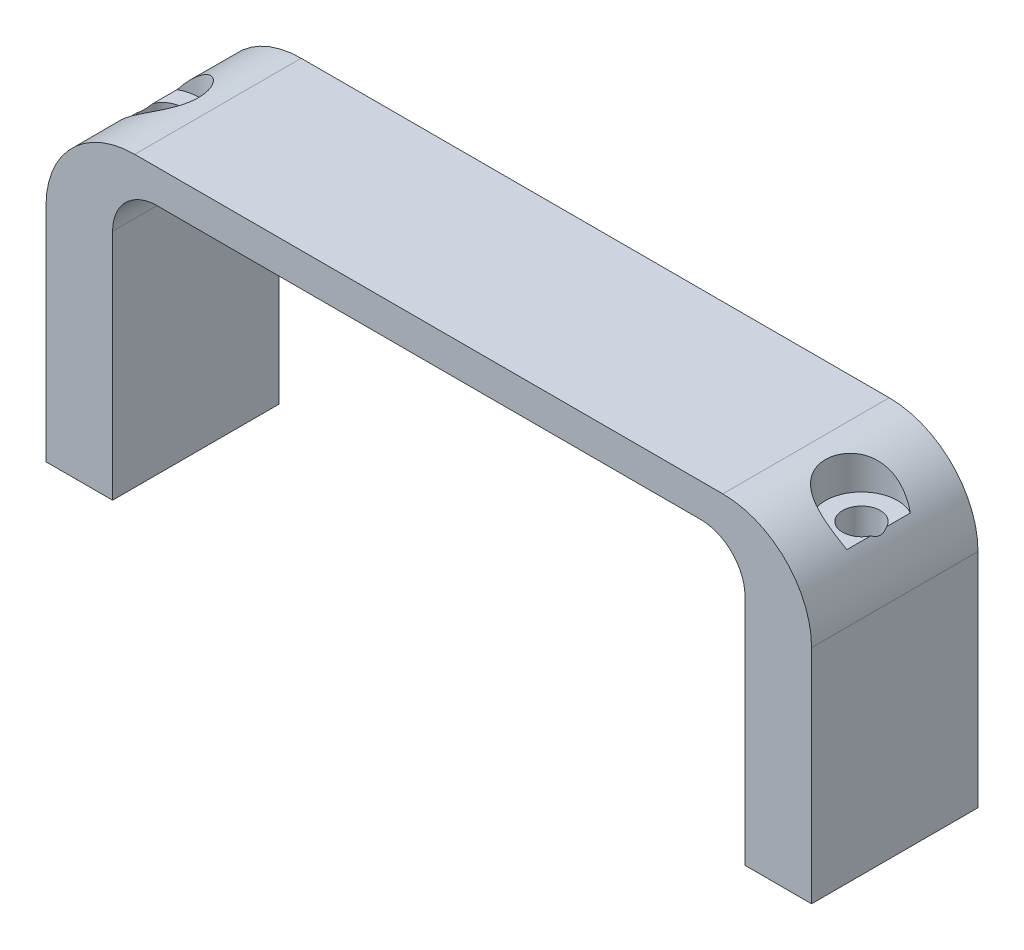
ISO-10303-21;
HEADER;
FILE_DESCRIPTION(('STEP AP214'),'2;1');
FILE_NAME('part.step','',(''),(''),'','','');
FILE_SCHEMA(('AUTOMOTIVE_DESIGN { 1 0 10303 214 1 1 1 1 }'));
ENDSEC;
DATA;
#1=APPLICATION_CONTEXT('core data for automotive mechanical design processes');
#2=APPLICATION_PROTOCOL_DEFINITION('international standard','automotive_design',2000,#1);
#3=PRODUCT_CONTEXT('',#1,'mechanical');
#4=PRODUCT('Part','Part','',(#3));
#5=PRODUCT_RELATED_PRODUCT_CATEGORY('part','',(#4));
#6=PRODUCT_DEFINITION_FORMATION('','',#4);
#7=PRODUCT_DEFINITION_CONTEXT('part definition',#1,'design');
#8=PRODUCT_DEFINITION('design','',#6,#7);
#9=PRODUCT_DEFINITION_SHAPE('','',#8);
#10=(LENGTH_UNIT() NAMED_UNIT(*) SI_UNIT(.MILLI.,.METRE.));
#11=(NAMED_UNIT(*) PLANE_ANGLE_UNIT() SI_UNIT($,.RADIAN.));
#12=(NAMED_UNIT(*) SI_UNIT($,.STERADIAN.) SOLID_ANGLE_UNIT());
#13=UNCERTAINTY_MEASURE_WITH_UNIT(LENGTH_MEASURE(1.E-05),#10,'distance_accuracy_value','');
#14=(GEOMETRIC_REPRESENTATION_CONTEXT(3) GLOBAL_UNCERTAINTY_ASSIGNED_CONTEXT((#13)) GLOBAL_UNIT_ASSIGNED_CONTEXT((#10,
#11,#12)) REPRESENTATION_CONTEXT('',''));
#15=CARTESIAN_POINT('',(0.,0.,0.));
#16=DIRECTION('',(0.,0.,1.));
#17=DIRECTION('',(1.,0.,0.));
#18=AXIS2_PLACEMENT_3D('',#15,#16,#17);
#19=CARTESIAN_POINT('',(-31.7717961729434,-8.00000000000006,15.));
#20=DIRECTION('',(1.,0.,0.));
#21=DIRECTION('',(0.,0.,-1.));
#22=AXIS2_PLACEMENT_3D('',#19,#20,#21);
#23=PLANE('',#22);
#24=DIRECTION('',(0.,-1.,0.));
#25=VECTOR('',#24,1.);
#26=CARTESIAN_POINT('',(-31.7717961729434,-8.00000000000006,0.));
#27=LINE('',#26,#25);
#28=CARTESIAN_POINT('',(-31.7717961729434,-8.00000000000006,0.));
#29=VERTEX_POINT('',#28);
#30=CARTESIAN_POINT('',(-31.7717961729434,-28.,0.));
#31=VERTEX_POINT('',#30);
#32=EDGE_CURVE('E261',#29,#31,#27,.T.);
#33=ORIENTED_EDGE('',*,*,#32,.T.);
#34=DIRECTION('',(0.,0.,-1.));
#35=VECTOR('',#34,1.);
#36=CARTESIAN_POINT('',(-31.7717961729434,-28.,15.));
#37=LINE('',#36,#35);
#38=CARTESIAN_POINT('',(-31.7717961729434,-28.,15.));
#39=VERTEX_POINT('',#38);
#40=EDGE_CURVE('E201',#39,#31,#37,.T.);
#41=ORIENTED_EDGE('',*,*,#40,.F.);
#42=DIRECTION('',(0.,-1.,0.));
#43=VECTOR('',#42,1.);
#44=CARTESIAN_POINT('',(-31.7717961729434,-8.00000000000006,15.));
#45=LINE('',#44,#43);
#46=CARTESIAN_POINT('',(-31.7717961729434,-8.00000000000006,15.));
#47=VERTEX_POINT('',#46);
#48=EDGE_CURVE('E291',#47,#39,#45,.T.);
#49=ORIENTED_EDGE('',*,*,#48,.F.);
#50=DIRECTION('',(0.,0.,-1.));
#51=VECTOR('',#50,1.);
#52=CARTESIAN_POINT('',(-31.7717961729434,-8.00000000000006,15.));
#53=LINE('',#52,#51);
#54=EDGE_CURVE('E292',#47,#29,#53,.T.);
#55=ORIENTED_EDGE('',*,*,#54,.T.);
#56=EDGE_LOOP('',(#33,#41,#49,#55));
#57=FACE_BOUND('',#56,.T.);
#58=ADVANCED_FACE('F33',(#57),#23,.F.);
#59=CARTESIAN_POINT('',(-25.7717961729434,-28.,15.));
#60=DIRECTION('',(0.,1.,0.));
#61=DIRECTION('',(0.,0.,1.));
#62=AXIS2_PLACEMENT_3D('',#59,#60,#61);
#63=PLANE('',#62);
#64=CARTESIAN_POINT('',(-28.7717961729434,-28.,7.5));
#65=DIRECTION('',(0.,1.,0.));
#66=DIRECTION('',(0.,0.,1.));
#67=AXIS2_PLACEMENT_3D('',#64,#65,#66);
#68=CIRCLE('',#67,1.69999999999999);
#69=CARTESIAN_POINT('',(-28.7717961729434,-28.,9.19999999999999));
#70=VERTEX_POINT('',#69);
#71=EDGE_CURVE('E248',#70,#70,#68,.T.);
#72=ORIENTED_EDGE('',*,*,#71,.T.);
#73=EDGE_LOOP('',(#72));
#74=FACE_BOUND('',#73,.T.);
#75=DIRECTION('',(1.,0.,0.));
#76=VECTOR('',#75,1.);
#77=CARTESIAN_POINT('',(-25.7717961729434,-28.,0.));
#78=LINE('',#77,#76);
#79=CARTESIAN_POINT('',(-25.7717961729434,-28.,0.));
#80=VERTEX_POINT('',#79);
#81=EDGE_CURVE('E251',#31,#80,#78,.T.);
#82=ORIENTED_EDGE('',*,*,#81,.T.);
#83=DIRECTION('',(0.,0.,-1.));
#84=VECTOR('',#83,1.);
#85=CARTESIAN_POINT('',(-25.7717961729434,-28.,15.));
#86=LINE('',#85,#84);
#87=CARTESIAN_POINT('',(-25.7717961729434,-28.,15.));
#88=VERTEX_POINT('',#87);
#89=EDGE_CURVE('E253',#88,#80,#86,.T.);
#90=ORIENTED_EDGE('',*,*,#89,.F.);
#91=DIRECTION('',(1.,0.,0.));
#92=VECTOR('',#91,1.);
#93=CARTESIAN_POINT('',(-25.7717961729434,-28.,15.));
#94=LINE('',#93,#92);
#95=EDGE_CURVE('E329',#39,#88,#94,.T.);
#96=ORIENTED_EDGE('',*,*,#95,.F.);
#97=ORIENTED_EDGE('',*,*,#40,.T.);
#98=EDGE_LOOP('',(#82,#90,#96,#97));
#99=FACE_BOUND('',#98,.T.);
#100=ADVANCED_FACE('F236',(#74,#99),#63,.F.);
#101=CARTESIAN_POINT('',(-25.7717961729434,-7.00000000000003,15.));
#102=DIRECTION('',(-1.,0.,0.));
#103=DIRECTION('',(0.,-1.,0.));
#104=AXIS2_PLACEMENT_3D('',#101,#102,#103);
#105=PLANE('',#104);
#106=DIRECTION('',(0.,1.,0.));
#107=VECTOR('',#106,1.);
#108=CARTESIAN_POINT('',(-25.7717961729434,-7.00000000000003,0.));
#109=LINE('',#108,#107);
#110=CARTESIAN_POINT('',(-25.7717961729434,-7.00000000000003,0.));
#111=VERTEX_POINT('',#110);
#112=EDGE_CURVE('E260',#80,#111,#109,.T.);
#113=ORIENTED_EDGE('',*,*,#112,.T.);
#114=DIRECTION('',(0.,0.,-1.));
#115=VECTOR('',#114,1.);
#116=CARTESIAN_POINT('',(-25.7717961729434,-7.00000000000003,15.));
#117=LINE('',#116,#115);
#118=CARTESIAN_POINT('',(-25.7717961729434,-7.00000000000003,15.));
#119=VERTEX_POINT('',#118);
#120=EDGE_CURVE('E266',#119,#111,#117,.T.);
#121=ORIENTED_EDGE('',*,*,#120,.F.);
#122=DIRECTION('',(0.,1.,0.));
#123=VECTOR('',#122,1.);
#124=CARTESIAN_POINT('',(-25.7717961729434,-7.00000000000003,15.));
#125=LINE('',#124,#123);
#126=EDGE_CURVE('E265',#88,#119,#125,.T.);
#127=ORIENTED_EDGE('',*,*,#126,.F.);
#128=ORIENTED_EDGE('',*,*,#89,.T.);
#129=EDGE_LOOP('',(#113,#121,#127,#128));
#130=FACE_BOUND('',#129,.T.);
#131=ADVANCED_FACE('F233',(#130),#105,.F.);
#132=CARTESIAN_POINT('',(-21.7717961729434,-7.,15.));
#133=DIRECTION('',(0.,0.,-1.));
#134=DIRECTION('',(-1.,0.,0.));
#135=AXIS2_PLACEMENT_3D('',#132,#133,#134);
#136=CYLINDRICAL_SURFACE('',#135,4.);
#137=CARTESIAN_POINT('',(-21.7717961729434,-7.,0.));
#138=DIRECTION('',(0.,0.,-1.));
#139=DIRECTION('',(1.,0.,0.));
#140=AXIS2_PLACEMENT_3D('',#137,#138,#139);
#141=CIRCLE('',#140,4.);
#142=CARTESIAN_POINT('',(-21.7717961729434,-3.,0.));
#143=VERTEX_POINT('',#142);
#144=EDGE_CURVE('E270',#111,#143,#141,.T.);
#145=ORIENTED_EDGE('',*,*,#144,.T.);
#146=DIRECTION('',(0.,0.,-1.));
#147=VECTOR('',#146,1.);
#148=CARTESIAN_POINT('',(-21.7717961729434,-3.,15.));
#149=LINE('',#148,#147);
#150=CARTESIAN_POINT('',(-21.7717961729434,-3.,15.));
#151=VERTEX_POINT('',#150);
#152=EDGE_CURVE('E317',#151,#143,#149,.T.);
#153=ORIENTED_EDGE('',*,*,#152,.F.);
#154=CARTESIAN_POINT('',(-21.7717961729434,-7.,15.));
#155=DIRECTION('',(0.,0.,-1.));
#156=DIRECTION('',(1.,0.,0.));
#157=AXIS2_PLACEMENT_3D('',#154,#155,#156);
#158=CIRCLE('',#157,4.);
#159=EDGE_CURVE('E322',#119,#151,#158,.T.);
#160=ORIENTED_EDGE('',*,*,#159,.F.);
#161=ORIENTED_EDGE('',*,*,#120,.T.);
#162=EDGE_LOOP('',(#145,#153,#160,#161));
#163=FACE_BOUND('',#162,.T.);
#164=ADVANCED_FACE('F229',(#163),#136,.F.);
#165=CARTESIAN_POINT('',(27.2282038270566,-2.99999999999999,15.));
#166=DIRECTION('',(0.,1.,0.));
#167=DIRECTION('',(-1.,0.,0.));
#168=AXIS2_PLACEMENT_3D('',#165,#166,#167);
#169=PLANE('',#168);
#170=DIRECTION('',(1.,0.,0.));
#171=VECTOR('',#170,1.);
#172=CARTESIAN_POINT('',(27.2282038270566,-2.99999999999999,0.));
#173=LINE('',#172,#171);
#174=CARTESIAN_POINT('',(27.2282038270566,-2.99999999999999,0.));
#175=VERTEX_POINT('',#174);
#176=EDGE_CURVE('E272',#143,#175,#173,.T.);
#177=ORIENTED_EDGE('',*,*,#176,.T.);
#178=DIRECTION('',(0.,0.,-1.));
#179=VECTOR('',#178,1.);
#180=CARTESIAN_POINT('',(27.2282038270566,-2.99999999999999,15.));
#181=LINE('',#180,#179);
#182=CARTESIAN_POINT('',(27.2282038270566,-2.99999999999999,15.));
#183=VERTEX_POINT('',#182);
#184=EDGE_CURVE('E314',#183,#175,#181,.T.);
#185=ORIENTED_EDGE('',*,*,#184,.F.);
#186=DIRECTION('',(1.,0.,0.));
#187=VECTOR('',#186,1.);
#188=CARTESIAN_POINT('',(27.2282038270566,-2.99999999999999,15.));
#189=LINE('',#188,#187);
#190=EDGE_CURVE('E325',#151,#183,#189,.T.);
#191=ORIENTED_EDGE('',*,*,#190,.F.);
#192=ORIENTED_EDGE('',*,*,#152,.T.);
#193=EDGE_LOOP('',(#177,#185,#191,#192));
#194=FACE_BOUND('',#193,.T.);
#195=ADVANCED_FACE('F225',(#194),#169,.F.);
#196=CARTESIAN_POINT('',(27.2282038270566,-6.99999999999999,15.));
#197=DIRECTION('',(0.,0.,-1.));
#198=DIRECTION('',(-1.,0.,0.));
#199=AXIS2_PLACEMENT_3D('',#196,#197,#198);
#200=CYLINDRICAL_SURFACE('',#199,4.);
#201=CARTESIAN_POINT('',(27.2282038270566,-6.99999999999999,0.));
#202=DIRECTION('',(0.,0.,-1.));
#203=DIRECTION('',(1.,0.,0.));
#204=AXIS2_PLACEMENT_3D('',#201,#202,#203);
#205=CIRCLE('',#204,4.);
#206=CARTESIAN_POINT('',(31.2282038270566,-7.00000000000002,0.));
#207=VERTEX_POINT('',#206);
#208=EDGE_CURVE('E277',#175,#207,#205,.T.);
#209=ORIENTED_EDGE('',*,*,#208,.T.);
#210=DIRECTION('',(0.,0.,-1.));
#211=VECTOR('',#210,1.);
#212=CARTESIAN_POINT('',(31.2282038270566,-7.00000000000002,15.));
#213=LINE('',#212,#211);
#214=CARTESIAN_POINT('',(31.2282038270566,-7.00000000000002,15.));
#215=VERTEX_POINT('',#214);
#216=EDGE_CURVE('E311',#215,#207,#213,.T.);
#217=ORIENTED_EDGE('',*,*,#216,.F.);
#218=CARTESIAN_POINT('',(27.2282038270566,-6.99999999999999,15.));
#219=DIRECTION('',(0.,0.,-1.));
#220=DIRECTION('',(1.,0.,0.));
#221=AXIS2_PLACEMENT_3D('',#218,#219,#220);
#222=CIRCLE('',#221,4.);
#223=EDGE_CURVE('E327',#183,#215,#222,.T.);
#224=ORIENTED_EDGE('',*,*,#223,.F.);
#225=ORIENTED_EDGE('',*,*,#184,.T.);
#226=EDGE_LOOP('',(#209,#217,#224,#225));
#227=FACE_BOUND('',#226,.T.);
#228=ADVANCED_FACE('F221',(#227),#200,.F.);
#229=CARTESIAN_POINT('',(31.2282038270566,-28.,15.));
#230=DIRECTION('',(1.,0.,0.));
#231=DIRECTION('',(0.,1.,0.));
#232=AXIS2_PLACEMENT_3D('',#229,#230,#231);
#233=PLANE('',#232);
#234=DIRECTION('',(0.,-1.,0.));
#235=VECTOR('',#234,1.);
#236=CARTESIAN_POINT('',(31.2282038270566,-28.,0.));
#237=LINE('',#236,#235);
#238=CARTESIAN_POINT('',(31.2282038270566,-28.,0.));
#239=VERTEX_POINT('',#238);
#240=EDGE_CURVE('E279',#207,#239,#237,.T.);
#241=ORIENTED_EDGE('',*,*,#240,.T.);
#242=DIRECTION('',(0.,0.,-1.));
#243=VECTOR('',#242,1.);
#244=CARTESIAN_POINT('',(31.2282038270566,-28.,15.));
#245=LINE('',#244,#243);
#246=CARTESIAN_POINT('',(31.2282038270566,-28.,15.));
#247=VERTEX_POINT('',#246);
#248=EDGE_CURVE('E308',#247,#239,#245,.T.);
#249=ORIENTED_EDGE('',*,*,#248,.F.);
#250=DIRECTION('',(0.,-1.,0.));
#251=VECTOR('',#250,1.);
#252=CARTESIAN_POINT('',(31.2282038270566,-28.,15.));
#253=LINE('',#252,#251);
#254=EDGE_CURVE('E334',#215,#247,#253,.T.);
#255=ORIENTED_EDGE('',*,*,#254,.F.);
#256=ORIENTED_EDGE('',*,*,#216,.T.);
#257=EDGE_LOOP('',(#241,#249,#255,#256));
#258=FACE_BOUND('',#257,.T.);
#259=ADVANCED_FACE('F217',(#258),#233,.F.);
#260=CARTESIAN_POINT('',(37.2282038270566,-28.,15.));
#261=DIRECTION('',(0.,1.,0.));
#262=DIRECTION('',(0.,0.,1.));
#263=AXIS2_PLACEMENT_3D('',#260,#261,#262);
#264=PLANE('',#263);
#265=CARTESIAN_POINT('',(34.2282038270566,-28.,7.5));
#266=DIRECTION('',(0.,1.,0.));
#267=DIRECTION('',(0.,0.,1.));
#268=AXIS2_PLACEMENT_3D('',#265,#266,#267);
#269=CIRCLE('',#268,1.69999999999999);
#270=CARTESIAN_POINT('',(34.2282038270566,-28.,9.19999999999999));
#271=VERTEX_POINT('',#270);
#272=EDGE_CURVE('E344',#271,#271,#269,.T.);
#273=ORIENTED_EDGE('',*,*,#272,.T.);
#274=EDGE_LOOP('',(#273));
#275=FACE_BOUND('',#274,.T.);
#276=DIRECTION('',(1.,0.,0.));
#277=VECTOR('',#276,1.);
#278=CARTESIAN_POINT('',(37.2282038270566,-28.,0.));
#279=LINE('',#278,#277);
#280=CARTESIAN_POINT('',(37.2282038270566,-28.,0.));
#281=VERTEX_POINT('',#280);
#282=EDGE_CURVE('E281',#239,#281,#279,.T.);
#283=ORIENTED_EDGE('',*,*,#282,.T.);
#284=DIRECTION('',(0.,0.,-1.));
#285=VECTOR('',#284,1.);
#286=CARTESIAN_POINT('',(37.2282038270566,-28.,15.));
#287=LINE('',#286,#285);
#288=CARTESIAN_POINT('',(37.2282038270566,-28.,15.));
#289=VERTEX_POINT('',#288);
#290=EDGE_CURVE('E305',#289,#281,#287,.T.);
#291=ORIENTED_EDGE('',*,*,#290,.F.);
#292=DIRECTION('',(1.,0.,0.));
#293=VECTOR('',#292,1.);
#294=CARTESIAN_POINT('',(37.2282038270566,-28.,15.));
#295=LINE('',#294,#293);
#296=EDGE_CURVE('E336',#247,#289,#295,.T.);
#297=ORIENTED_EDGE('',*,*,#296,.F.);
#298=ORIENTED_EDGE('',*,*,#248,.T.);
#299=EDGE_LOOP('',(#283,#291,#297,#298));
#300=FACE_BOUND('',#299,.T.);
#301=ADVANCED_FACE('F213',(#275,#300),#264,.F.);
#302=CARTESIAN_POINT('',(37.2282038270566,-8.00000000000006,15.));
#303=DIRECTION('',(-1.,0.,0.));
#304=DIRECTION('',(0.,-1.,0.));
#305=AXIS2_PLACEMENT_3D('',#302,#303,#304);
#306=PLANE('',#305);
#307=DIRECTION('',(0.,1.,0.));
#308=VECTOR('',#307,1.);
#309=CARTESIAN_POINT('',(37.2282038270566,-8.00000000000006,0.));
#310=LINE('',#309,#308);
#311=CARTESIAN_POINT('',(37.2282038270566,-8.00000000000006,0.));
#312=VERTEX_POINT('',#311);
#313=EDGE_CURVE('E283',#281,#312,#310,.T.);
#314=ORIENTED_EDGE('',*,*,#313,.T.);
#315=DIRECTION('',(0.,0.,-1.));
#316=VECTOR('',#315,1.);
#317=CARTESIAN_POINT('',(37.2282038270566,-8.00000000000006,15.));
#318=LINE('',#317,#316);
#319=CARTESIAN_POINT('',(37.2282038270566,-8.00000000000006,15.));
#320=VERTEX_POINT('',#319);
#321=EDGE_CURVE('E302',#320,#312,#318,.T.);
#322=ORIENTED_EDGE('',*,*,#321,.F.);
#323=DIRECTION('',(0.,1.,0.));
#324=VECTOR('',#323,1.);
#325=CARTESIAN_POINT('',(37.2282038270566,-8.00000000000006,15.));
#326=LINE('',#325,#324);
#327=EDGE_CURVE('E338',#289,#320,#326,.T.);
#328=ORIENTED_EDGE('',*,*,#327,.F.);
#329=ORIENTED_EDGE('',*,*,#290,.T.);
#330=EDGE_LOOP('',(#314,#322,#328,#329));
#331=FACE_BOUND('',#330,.T.);
#332=ADVANCED_FACE('F208',(#331),#306,.F.);
#333=CARTESIAN_POINT('',(29.2282038270566,-8.,15.));
#334=DIRECTION('',(0.,0.,-1.));
#335=DIRECTION('',(-1.,0.,0.));
#336=AXIS2_PLACEMENT_3D('',#333,#334,#335);
#337=CYLINDRICAL_SURFACE('',#336,8.);
#338=DIRECTION('',(0.,0.,-1.));
#339=VECTOR('',#338,1.);
#340=CARTESIAN_POINT('',(35.7734310958381,-3.4,15.));
#341=LINE('',#340,#339);
#342=CARTESIAN_POINT('',(35.7734310958381,-3.4,4.64084406024885));
#343=VERTEX_POINT('',#342);
#344=CARTESIAN_POINT('',(35.7734310958381,-3.4,6.79128800785206));
#345=VERTEX_POINT('',#344);
#346=EDGE_CURVE('E406',#343,#345,#341,.F.);
#347=ORIENTED_EDGE('',*,*,#346,.T.);
#348=CARTESIAN_POINT('',(35.7734310958381,-3.4,6.79128800785207));
#349=CARTESIAN_POINT('',(35.795752294614,-3.43174604220147,6.83995252716815));
#350=CARTESIAN_POINT('',(35.8163577448422,-3.46157267974598,6.89095779793902));
#351=CARTESIAN_POINT('',(35.8534271815947,-3.51586335765246,6.99809341063674));
#352=CARTESIAN_POINT('',(35.8698297438135,-3.5402472569436,7.05428503938404));
#353=CARTESIAN_POINT('',(35.8972166303443,-3.58130146287132,7.17133051001694));
#354=CARTESIAN_POINT('',(35.9081572185446,-3.59790944106849,7.23221761551841));
#355=CARTESIAN_POINT('',(35.9232599981621,-3.62091073917617,7.35630833024998));
#356=CARTESIAN_POINT('',(35.9274731391221,-3.62738083013387,7.41949078501428));
#357=CARTESIAN_POINT('',(35.9286892710372,-3.62924602852597,7.53910454210514));
#358=CARTESIAN_POINT('',(35.926434888904,-3.62578184782882,7.5955134062344));
#359=CARTESIAN_POINT('',(35.9164819692441,-3.61057899314852,7.70706814831267));
#360=CARTESIAN_POINT('',(35.908746697261,-3.59878448872428,7.76220289763234));
#361=CARTESIAN_POINT('',(35.8850110585707,-3.56293954282801,7.88775381528332));
#362=CARTESIAN_POINT('',(35.8670919211342,-3.53608153100383,7.95697102846103));
#363=CARTESIAN_POINT('',(35.8246877852925,-3.47365006644133,8.08819285680184));
#364=CARTESIAN_POINT('',(35.8002825996495,-3.43818298229986,8.15027281547901));
#365=CARTESIAN_POINT('',(35.7734310958381,-3.4,8.20871199214793));
#366=B_SPLINE_CURVE_WITH_KNOTS('',3,(#348,#349,#350,#351,#352,#353,#354,#355,#356,#357,#358,
#359,#360,#361,#362,#363,#364,#365),.UNSPECIFIED.,.F.,.F.,(4,2,2,2,2,2,2,2,4),(0.,
0.186998280117518,0.376590948134752,0.567678337442953,0.757311565135716,0.9260703660623,
1.09597106708932,1.32379873554434,1.54894323601952),.UNSPECIFIED.);
#367=CARTESIAN_POINT('',(35.7734310958381,-3.4,8.20871199214794));
#368=VERTEX_POINT('',#367);
#369=EDGE_CURVE('E154',#345,#368,#366,.T.);
#370=ORIENTED_EDGE('',*,*,#369,.T.);
#371=CARTESIAN_POINT('',(35.7734310958381,-3.4,10.3591559397512));
#372=VERTEX_POINT('',#371);
#373=EDGE_CURVE('E200',#368,#372,#341,.F.);
#374=ORIENTED_EDGE('',*,*,#373,.T.);
#375=CARTESIAN_POINT('',(35.7734310958381,-3.4,10.3591559397512));
#376=CARTESIAN_POINT('',(35.680890058991,-3.26831022089461,10.4091506371465));
#377=CARTESIAN_POINT('',(35.5837088141565,-3.13849678043375,10.4558813270894));
#378=CARTESIAN_POINT('',(35.3799008241908,-2.88303146540489,10.5411127973677));
#379=CARTESIAN_POINT('',(35.2732473319728,-2.75739284658688,10.579589152872));
#380=CARTESIAN_POINT('',(35.0496919044275,-2.51015955989723,10.646650575546));
#381=CARTESIAN_POINT('',(34.9326932426588,-2.38862193894804,10.6751263692509));
#382=CARTESIAN_POINT('',(34.6900715446301,-2.15221279825739,10.7193721335033));
#383=CARTESIAN_POINT('',(34.5644599016775,-2.03733282943916,10.7351585507085));
#384=CARTESIAN_POINT('',(34.3523018166037,-1.85544820452498,10.748687774597));
#385=CARTESIAN_POINT('',(34.2680097758148,-1.78612307493373,10.7508853609046));
#386=CARTESIAN_POINT('',(34.0967264020196,-1.65103386017316,10.7484681717919));
#387=CARTESIAN_POINT('',(34.0097358848978,-1.585268714836,10.7438554361933));
#388=CARTESIAN_POINT('',(33.8338801100427,-1.45786747932385,10.7271944373876));
#389=CARTESIAN_POINT('',(33.7450216574109,-1.39621897925313,10.7151697542752));
#390=CARTESIAN_POINT('',(33.5659266877181,-1.2772244828918,10.6831052457596));
#391=CARTESIAN_POINT('',(33.4756908659925,-1.21987639679877,10.6630693438085));
#392=CARTESIAN_POINT('',(33.2936685766268,-1.10917506495977,10.6141808025231));
#393=CARTESIAN_POINT('',(33.2018760882303,-1.05587405822665,10.585231449052));
#394=CARTESIAN_POINT('',(33.0188862513986,-0.95431549552638,10.5182011944622));
#395=CARTESIAN_POINT('',(32.9276886235224,-0.906055383303832,10.480124954215));
#396=CARTESIAN_POINT('',(32.7470423334672,-0.814735650595902,10.394589911492));
#397=CARTESIAN_POINT('',(32.6575943503692,-0.771678017025121,10.3471275424273));
#398=CARTESIAN_POINT('',(32.4818234521891,-0.69087463628475,10.2428257960943));
#399=CARTESIAN_POINT('',(32.3955000212567,-0.653128009292179,10.1859879753631));
#400=CARTESIAN_POINT('',(32.238836609303,-0.587693619446765,10.0715755584473));
#401=CARTESIAN_POINT('',(32.1679246047527,-0.559336170020932,10.0151633690412));
#402=CARTESIAN_POINT('',(32.0302929451237,-0.506420657869213,9.89582604618741));
#403=CARTESIAN_POINT('',(31.9635728864756,-0.481862229067972,9.83290154124586));
#404=CARTESIAN_POINT('',(31.8351417539213,-0.436368774461021,9.70095948369382));
#405=CARTESIAN_POINT('',(31.7734291819559,-0.415432662850721,9.63194376634949));
#406=CARTESIAN_POINT('',(31.6557318937429,-0.376946766881995,9.4883464951426));
#407=CARTESIAN_POINT('',(31.5997470153113,-0.359396886627348,9.41376509898));
#408=CARTESIAN_POINT('',(31.4490403189685,-0.313754512252109,9.19371713224274));
#409=CARTESIAN_POINT('',(31.3620135634233,-0.289439497517147,9.04205415421388));
#410=CARTESIAN_POINT('',(31.2131809015843,-0.249784479175574,8.72585686618598));
#411=CARTESIAN_POINT('',(31.1513733029407,-0.234443873304844,8.56132342075219));
#412=CARTESIAN_POINT('',(31.0548817781761,-0.211179110447415,8.22349952422331));
#413=CARTESIAN_POINT('',(31.020269884659,-0.20327463852928,8.05018710270638));
#414=CARTESIAN_POINT('',(30.9795819304946,-0.194033173727887,7.70007065320998));
#415=CARTESIAN_POINT('',(30.973508105395,-0.19269669535214,7.52326635278137));
#416=CARTESIAN_POINT('',(30.9901736714197,-0.196440796718096,7.16930286377928));
#417=CARTESIAN_POINT('',(31.0132024810583,-0.201585831896017,6.99215788150002));
#418=CARTESIAN_POINT('',(31.0878226375477,-0.219044361672014,6.64434924082131));
#419=CARTESIAN_POINT('',(31.1394140205936,-0.231357865354096,6.4736855906354));
#420=CARTESIAN_POINT('',(31.2693090320677,-0.264474853869978,6.1439813014086));
#421=CARTESIAN_POINT('',(31.3475765557068,-0.285266870902445,5.98492530344185));
#422=CARTESIAN_POINT('',(31.5279565982959,-0.337108805713303,5.68283223559747));
#423=CARTESIAN_POINT('',(31.6300647867361,-0.368156860969862,5.53979226348064));
#424=CARTESIAN_POINT('',(31.8527784321371,-0.44188104437888,5.27527513964399));
#425=CARTESIAN_POINT('',(31.973157287135,-0.484419118866741,5.15356859988358));
#426=CARTESIAN_POINT('',(32.2282938029483,-0.582581318862474,4.93264013086096));
#427=CARTESIAN_POINT('',(32.3630500991309,-0.638204203030163,4.83341607046486));
#428=CARTESIAN_POINT('',(32.6419850011914,-0.763320577920829,4.65858719216972));
#429=CARTESIAN_POINT('',(32.7862000267949,-0.832870089418735,4.58308103833054));
#430=CARTESIAN_POINT('',(33.078052322385,-0.985316310800062,4.45615299697684));
#431=CARTESIAN_POINT('',(33.225690230407,-1.06821552651286,4.40473563818873));
#432=CARTESIAN_POINT('',(33.5307350170723,-1.25297330195232,4.32149401373021));
#433=CARTESIAN_POINT('',(33.6880373966262,-1.35579099427787,4.29144317385305));
#434=CARTESIAN_POINT('',(33.996746031828,-1.57374303606311,4.25451963002773));
#435=CARTESIAN_POINT('',(34.1481472111858,-1.68888768371135,4.2476664642497));
#436=CARTESIAN_POINT('',(34.4080543903074,-1.90159756331439,4.2530114563378));
#437=CARTESIAN_POINT('',(34.5183934358768,-1.99708359167218,4.26117631747612));
#438=CARTESIAN_POINT('',(34.7330613121051,-2.19330344803422,4.28762998488239));
#439=CARTESIAN_POINT('',(34.8373869253597,-2.29404003138712,4.30592415619257));
#440=CARTESIAN_POINT('',(35.1406864943502,-2.60317170537765,4.37384755501717));
#441=CARTESIAN_POINT('',(35.3299435976225,-2.81845614579528,4.43651584186498));
#442=CARTESIAN_POINT('',(35.5518551433193,-3.09926849554192,4.53132420109853));
#443=CARTESIAN_POINT('',(35.5976241283347,-3.1589124621389,4.55217583001752));
#444=CARTESIAN_POINT('',(35.6870513159,-3.27889397449572,4.59539720425794));
#445=CARTESIAN_POINT('',(35.730715978916,-3.33922858594273,4.61776171884585));
#446=CARTESIAN_POINT('',(35.7734310958382,-3.4,4.64084406024856));
#447=B_SPLINE_CURVE_WITH_KNOTS('',3,(#375,#376,#377,#378,#379,#380,#381,#382,#383,#384,#385,
#386,#387,#388,#389,#390,#391,#392,#393,#394,#395,#396,#397,#398,#399,#400,#401,#402,#403,#404,
#405,#406,#407,#408,#409,#410,#411,#412,#413,#414,#415,#416,#417,#418,#419,#420,#421,#422,#423,
#424,#425,#426,#427,#428,#429,#430,#431,#432,#433,#434,#435,#436,#437,#438,#439,#440,#441,#442,
#443,#444,#445,#446),.UNSPECIFIED.,.F.,.F.,(4,2,2,2,2,2,2,2,2,2,2,2,2,2,2,2,2,2,2,2,2,2,2,2,2,2,
2,2,2,2,2,2,2,2,2,4),(0.,0.505685260557182,1.01284682771184,1.52538916744179,2.03726612677608,
2.36448344660698,2.69160277847021,3.01768675823045,3.34361123530456,3.67320476400519,
4.00263033483354,4.33218132382249,4.66167765485308,4.94614059438266,5.23057610583642,
5.51492620829339,5.79926825692858,6.3261669456701,6.85303027067989,7.38128442531433,
7.909579960379,8.44317084749425,8.97676241078643,9.50963463431468,10.0424101400855,
10.5690490274406,11.095637973331,11.6243893220574,12.1532400369093,12.7220393828158,
13.2913176791907,13.7291596027333,14.1672336536912,15.0435338061967,15.277582472141,
15.5108596433114),.UNSPECIFIED.);
#448=EDGE_CURVE('E194',#372,#343,#447,.T.);
#449=ORIENTED_EDGE('',*,*,#448,.T.);
#450=EDGE_LOOP('',(#347,#370,#374,#449));
#451=FACE_BOUND('',#450,.T.);
#452=CARTESIAN_POINT('',(29.2282038270566,-8.,0.));
#453=DIRECTION('',(0.,0.,1.));
#454=DIRECTION('',(-1.,0.,0.));
#455=AXIS2_PLACEMENT_3D('',#452,#453,#454);
#456=CIRCLE('',#455,8.);
#457=CARTESIAN_POINT('',(29.2282038270566,0.,0.));
#458=VERTEX_POINT('',#457);
#459=EDGE_CURVE('E285',#312,#458,#456,.T.);
#460=ORIENTED_EDGE('',*,*,#459,.T.);
#461=DIRECTION('',(0.,0.,-1.));
#462=VECTOR('',#461,1.);
#463=CARTESIAN_POINT('',(29.2282038270566,0.,15.));
#464=LINE('',#463,#462);
#465=CARTESIAN_POINT('',(29.2282038270566,0.,15.));
#466=VERTEX_POINT('',#465);
#467=EDGE_CURVE('E299',#466,#458,#464,.T.);
#468=ORIENTED_EDGE('',*,*,#467,.F.);
#469=CARTESIAN_POINT('',(29.2282038270566,-8.,15.));
#470=DIRECTION('',(0.,0.,1.));
#471=DIRECTION('',(-1.,0.,0.));
#472=AXIS2_PLACEMENT_3D('',#469,#470,#471);
#473=CIRCLE('',#472,8.);
#474=EDGE_CURVE('E340',#320,#466,#473,.T.);
#475=ORIENTED_EDGE('',*,*,#474,.F.);
#476=ORIENTED_EDGE('',*,*,#321,.T.);
#477=EDGE_LOOP('',(#460,#468,#475,#476));
#478=FACE_BOUND('',#477,.T.);
#479=ADVANCED_FACE('F203',(#451,#478),#337,.T.);
#480=CARTESIAN_POINT('',(-23.7717961729433,0.,15.));
#481=DIRECTION('',(0.,-1.,0.));
#482=DIRECTION('',(0.,0.,-1.));
#483=AXIS2_PLACEMENT_3D('',#480,#481,#482);
#484=PLANE('',#483);
#485=DIRECTION('',(-1.,0.,0.));
#486=VECTOR('',#485,1.);
#487=CARTESIAN_POINT('',(-23.7717961729433,0.,0.));
#488=LINE('',#487,#486);
#489=CARTESIAN_POINT('',(-23.7717961729433,0.,0.));
#490=VERTEX_POINT('',#489);
#491=EDGE_CURVE('E287',#458,#490,#488,.T.);
#492=ORIENTED_EDGE('',*,*,#491,.T.);
#493=DIRECTION('',(0.,0.,-1.));
#494=VECTOR('',#493,1.);
#495=CARTESIAN_POINT('',(-23.7717961729433,0.,15.));
#496=LINE('',#495,#494);
#497=CARTESIAN_POINT('',(-23.7717961729433,0.,15.));
#498=VERTEX_POINT('',#497);
#499=EDGE_CURVE('E295',#498,#490,#496,.T.);
#500=ORIENTED_EDGE('',*,*,#499,.F.);
#501=DIRECTION('',(-1.,0.,0.));
#502=VECTOR('',#501,1.);
#503=CARTESIAN_POINT('',(-23.7717961729433,0.,15.));
#504=LINE('',#503,#502);
#505=EDGE_CURVE('E342',#466,#498,#504,.T.);
#506=ORIENTED_EDGE('',*,*,#505,.F.);
#507=ORIENTED_EDGE('',*,*,#467,.T.);
#508=EDGE_LOOP('',(#492,#500,#506,#507));
#509=FACE_BOUND('',#508,.T.);
#510=ADVANCED_FACE('F207',(#509),#484,.F.);
#511=CARTESIAN_POINT('',(-23.7717961729434,-8.,15.));
#512=DIRECTION('',(0.,0.,-1.));
#513=DIRECTION('',(-1.,0.,0.));
#514=AXIS2_PLACEMENT_3D('',#511,#512,#513);
#515=CYLINDRICAL_SURFACE('',#514,8.);
#516=DIRECTION('',(0.,0.,-1.));
#517=VECTOR('',#516,1.);
#518=CARTESIAN_POINT('',(-30.3170234417248,-3.4,15.));
#519=LINE('',#518,#517);
#520=CARTESIAN_POINT('',(-30.3170234417248,-3.4,10.3591559397511));
#521=VERTEX_POINT('',#520);
#522=CARTESIAN_POINT('',(-30.3170234417248,-3.4,8.20871199214793));
#523=VERTEX_POINT('',#522);
#524=EDGE_CURVE('E45',#521,#523,#519,.T.);
#525=ORIENTED_EDGE('',*,*,#524,.T.);
#526=CARTESIAN_POINT('',(-30.3170234417248,-3.4,8.20871199214792));
#527=CARTESIAN_POINT('',(-30.3393446405007,-3.43174604220147,8.16004747283183));
#528=CARTESIAN_POINT('',(-30.359950090729,-3.46157267974598,8.10904220206097));
#529=CARTESIAN_POINT('',(-30.3970195274815,-3.51586335765246,8.00190658936325));
#530=CARTESIAN_POINT('',(-30.4134220897003,-3.54024725694359,7.94571496061595));
#531=CARTESIAN_POINT('',(-30.440808976231,-3.58130146287131,7.82866948998305));
#532=CARTESIAN_POINT('',(-30.4517495644313,-3.59790944106848,7.76778238448157));
#533=CARTESIAN_POINT('',(-30.4668523440488,-3.62091073917616,7.64369166975001));
#534=CARTESIAN_POINT('',(-30.4710654850089,-3.62738083013386,7.58050921498571));
#535=CARTESIAN_POINT('',(-30.4722816169239,-3.62924602852596,7.46089545789485));
#536=CARTESIAN_POINT('',(-30.4700272347907,-3.62578184782881,7.40448659376559));
#537=CARTESIAN_POINT('',(-30.4600743151309,-3.61057899314851,7.29293185168732));
#538=CARTESIAN_POINT('',(-30.4523390431478,-3.59878448872427,7.23779710236765));
#539=CARTESIAN_POINT('',(-30.4286034044575,-3.56293954282799,7.11224618471667));
#540=CARTESIAN_POINT('',(-30.4106842670209,-3.53608153100382,7.04302897153897));
#541=CARTESIAN_POINT('',(-30.3682801311793,-3.47365006644133,6.91180714319817));
#542=CARTESIAN_POINT('',(-30.3438749455362,-3.43818298229986,6.849727184521));
#543=CARTESIAN_POINT('',(-30.3170234417248,-3.4,6.79128800785208));
#544=B_SPLINE_CURVE_WITH_KNOTS('',3,(#526,#527,#528,#529,#530,#531,#532,#533,#534,#535,#536,
#537,#538,#539,#540,#541,#542,#543),.UNSPECIFIED.,.F.,.F.,(4,2,2,2,2,2,2,2,4),(0.,
0.18699828011752,0.376590948134749,0.567678337442946,0.757311565135707,0.926070366062291,
1.09597106708931,1.32379873554432,1.54894323601948),.UNSPECIFIED.);
#545=CARTESIAN_POINT('',(-30.3170234417248,-3.4,6.79128800785207));
#546=VERTEX_POINT('',#545);
#547=EDGE_CURVE('E11',#523,#546,#544,.T.);
#548=ORIENTED_EDGE('',*,*,#547,.T.);
#549=CARTESIAN_POINT('',(-30.3170234417248,-3.4,4.64084406024885));
#550=VERTEX_POINT('',#549);
#551=EDGE_CURVE('E153',#546,#550,#519,.T.);
#552=ORIENTED_EDGE('',*,*,#551,.T.);
#553=CARTESIAN_POINT('',(-30.3170234417248,-3.4,4.64084406024885));
#554=CARTESIAN_POINT('',(-30.2244824048777,-3.26831022089461,4.59084936285353));
#555=CARTESIAN_POINT('',(-30.1273011600433,-3.13849678043375,4.54411867291062));
#556=CARTESIAN_POINT('',(-29.9234931700776,-2.8830314654049,4.45888720263235));
#557=CARTESIAN_POINT('',(-29.8168396778596,-2.75739284658689,4.42041084712805));
#558=CARTESIAN_POINT('',(-29.5932842503142,-2.51015955989723,4.35334942445403));
#559=CARTESIAN_POINT('',(-29.4762855885456,-2.38862193894803,4.32487363074905));
#560=CARTESIAN_POINT('',(-29.2336638905169,-2.15221279825738,4.28062786649665));
#561=CARTESIAN_POINT('',(-29.1080522475642,-2.03733282943916,4.26484144929154));
#562=CARTESIAN_POINT('',(-28.8958941624905,-1.85544820452498,4.25131222540302));
#563=CARTESIAN_POINT('',(-28.8116021217016,-1.78612307493374,4.24911463909537));
#564=CARTESIAN_POINT('',(-28.6403187479063,-1.65103386017316,4.25153182820807));
#565=CARTESIAN_POINT('',(-28.5533282307846,-1.585268714836,4.2561445638067));
#566=CARTESIAN_POINT('',(-28.3774724559295,-1.45786747932385,4.27280556261244));
#567=CARTESIAN_POINT('',(-28.2886140032977,-1.39621897925313,4.28483024572476));
#568=CARTESIAN_POINT('',(-28.1095190336049,-1.2772244828918,4.31689475424039));
#569=CARTESIAN_POINT('',(-28.0192832118792,-1.21987639679877,4.33693065619155));
#570=CARTESIAN_POINT('',(-27.8372609225136,-1.10917506495977,4.38581919747689));
#571=CARTESIAN_POINT('',(-27.7454684341171,-1.05587405822665,4.41476855094796));
#572=CARTESIAN_POINT('',(-27.5624785972853,-0.954315495526383,4.48179880553775));
#573=CARTESIAN_POINT('',(-27.4712809694092,-0.906055383303833,4.51987504578498));
#574=CARTESIAN_POINT('',(-27.290634679354,-0.814735650595902,4.60541008850796));
#575=CARTESIAN_POINT('',(-27.2011866962559,-0.771678017025121,4.65287245757265));
#576=CARTESIAN_POINT('',(-27.0254157980758,-0.69087463628475,4.75717420390573));
#577=CARTESIAN_POINT('',(-26.9390923671435,-0.653128009292179,4.81401202463688));
#578=CARTESIAN_POINT('',(-26.7824289551897,-0.587693619446764,4.92842444155269));
#579=CARTESIAN_POINT('',(-26.7115169506394,-0.55933617002093,4.98483663095878));
#580=CARTESIAN_POINT('',(-26.5738852910105,-0.506420657869211,5.10417395381259));
#581=CARTESIAN_POINT('',(-26.5071652323623,-0.481862229067969,5.16709845875414));
#582=CARTESIAN_POINT('',(-26.3787340998081,-0.436368774461019,5.29904051630618));
#583=CARTESIAN_POINT('',(-26.3170215278426,-0.415432662850719,5.36805623365051));
#584=CARTESIAN_POINT('',(-26.1993242396297,-0.376946766881994,5.5116535048574));
#585=CARTESIAN_POINT('',(-26.143339361198,-0.359396886627347,5.58623490102));
#586=CARTESIAN_POINT('',(-25.9926326648552,-0.313754512252107,5.80628286775726));
#587=CARTESIAN_POINT('',(-25.9056059093101,-0.289439497517146,5.95794584578612));
#588=CARTESIAN_POINT('',(-25.756773247471,-0.249784479175573,6.27414313381402));
#589=CARTESIAN_POINT('',(-25.6949656488275,-0.234443873304843,6.43867657924781));
#590=CARTESIAN_POINT('',(-25.5984741240629,-0.211179110447413,6.77650047577669));
#591=CARTESIAN_POINT('',(-25.5638622305457,-0.203274638529279,6.94981289729362));
#592=CARTESIAN_POINT('',(-25.5231742763814,-0.194033173727887,7.29992934679002));
#593=CARTESIAN_POINT('',(-25.5171004512817,-0.192696695352139,7.47673364721863));
#594=CARTESIAN_POINT('',(-25.5337660173065,-0.196440796718095,7.83069713622072));
#595=CARTESIAN_POINT('',(-25.556794826945,-0.201585831896016,8.00784211849998));
#596=CARTESIAN_POINT('',(-25.6314149834344,-0.219044361672013,8.35565075917869));
#597=CARTESIAN_POINT('',(-25.6830063664803,-0.231357865354095,8.5263144093646));
#598=CARTESIAN_POINT('',(-25.8129013779545,-0.264474853869977,8.8560186985914));
#599=CARTESIAN_POINT('',(-25.8911689015935,-0.285266870902444,9.01507469655814));
#600=CARTESIAN_POINT('',(-26.0715489441827,-0.337108805713303,9.31716776440253));
#601=CARTESIAN_POINT('',(-26.1736571326229,-0.368156860969861,9.46020773651936));
#602=CARTESIAN_POINT('',(-26.3963707780238,-0.441881044378879,9.724724860356));
#603=CARTESIAN_POINT('',(-26.5167496330217,-0.484419118866739,9.84643140011642));
#604=CARTESIAN_POINT('',(-26.7718861488351,-0.582581318862472,10.067359869139));
#605=CARTESIAN_POINT('',(-26.9066424450177,-0.638204203030161,10.1665839295351));
#606=CARTESIAN_POINT('',(-27.1855773470781,-0.763320577920826,10.3414128078303));
#607=CARTESIAN_POINT('',(-27.3297923726817,-0.83287008941873,10.4169189616695));
#608=CARTESIAN_POINT('',(-27.6216446682717,-0.985316310800057,10.5438470030232));
#609=CARTESIAN_POINT('',(-27.7692825762937,-1.06821552651285,10.5952643618113));
#610=CARTESIAN_POINT('',(-28.074327362959,-1.25297330195232,10.6785059862698));
#611=CARTESIAN_POINT('',(-28.2316297425129,-1.35579099427787,10.7085568261469));
#612=CARTESIAN_POINT('',(-28.5403383777147,-1.5737430360631,10.7454803699723));
#613=CARTESIAN_POINT('',(-28.6917395570726,-1.68888768371134,10.7523335357503));
#614=CARTESIAN_POINT('',(-28.9516467361942,-1.90159756331438,10.7469885436622));
#615=CARTESIAN_POINT('',(-29.0619857817635,-1.99708359167218,10.7388236825239));
#616=CARTESIAN_POINT('',(-29.2766536579919,-2.19330344803422,10.7123700151176));
#617=CARTESIAN_POINT('',(-29.3809792712464,-2.29404003138712,10.6940758438074));
#618=CARTESIAN_POINT('',(-29.6842788402369,-2.60317170537765,10.6261524449828));
#619=CARTESIAN_POINT('',(-29.8735359435092,-2.81845614579528,10.563484158135));
#620=CARTESIAN_POINT('',(-30.095447489206,-3.09926849554192,10.4686757989015));
#621=CARTESIAN_POINT('',(-30.1412164742214,-3.1589124621389,10.4478241699825));
#622=CARTESIAN_POINT('',(-30.2306436617867,-3.27889397449571,10.4046027957421));
#623=CARTESIAN_POINT('',(-30.2743083248028,-3.33922858594272,10.3822382811541));
#624=CARTESIAN_POINT('',(-30.3170234417249,-3.4,10.3591559397514));
#625=B_SPLINE_CURVE_WITH_KNOTS('',3,(#553,#554,#555,#556,#557,#558,#559,#560,#561,#562,#563,
#564,#565,#566,#567,#568,#569,#570,#571,#572,#573,#574,#575,#576,#577,#578,#579,#580,#581,#582,
#583,#584,#585,#586,#587,#588,#589,#590,#591,#592,#593,#594,#595,#596,#597,#598,#599,#600,#601,
#602,#603,#604,#605,#606,#607,#608,#609,#610,#611,#612,#613,#614,#615,#616,#617,#618,#619,#620,
#621,#622,#623,#624),.UNSPECIFIED.,.F.,.F.,(4,2,2,2,2,2,2,2,2,2,2,2,2,2,2,2,2,2,2,2,2,2,2,2,2,2,
2,2,2,2,2,2,2,2,2,4),(0.,0.505685260557181,1.01284682771184,1.52538916744179,2.03726612677608,
2.36448344660698,2.69160277847021,3.01768675823044,3.34361123530456,3.67320476400518,
4.00263033483354,4.33218132382249,4.66167765485308,4.94614059438267,5.23057610583643,
5.51492620829339,5.79926825692858,6.32616694567011,6.8530302706799,7.38128442531434,
7.90957996037901,8.44317084749426,8.97676241078644,9.50963463431468,10.0424101400855,
10.5690490274406,11.095637973331,11.6243893220574,12.1532400369093,12.7220393828158,
13.2913176791907,13.7291596027333,14.1672336536912,15.0435338061967,15.277582472141,
15.5108596433115),.UNSPECIFIED.);
#626=EDGE_CURVE('E148',#550,#521,#625,.T.);
#627=ORIENTED_EDGE('',*,*,#626,.T.);
#628=EDGE_LOOP('',(#525,#548,#552,#627));
#629=FACE_BOUND('',#628,.T.);
#630=CARTESIAN_POINT('',(-23.7717961729434,-8.,0.));
#631=DIRECTION('',(0.,0.,1.));
#632=DIRECTION('',(1.,0.,0.));
#633=AXIS2_PLACEMENT_3D('',#630,#631,#632);
#634=CIRCLE('',#633,8.);
#635=EDGE_CURVE('E289',#490,#29,#634,.T.);
#636=ORIENTED_EDGE('',*,*,#635,.T.);
#637=ORIENTED_EDGE('',*,*,#54,.F.);
#638=CARTESIAN_POINT('',(-23.7717961729434,-8.,15.));
#639=DIRECTION('',(0.,0.,1.));
#640=DIRECTION('',(1.,0.,0.));
#641=AXIS2_PLACEMENT_3D('',#638,#639,#640);
#642=CIRCLE('',#641,8.);
#643=EDGE_CURVE('E296',#498,#47,#642,.T.);
#644=ORIENTED_EDGE('',*,*,#643,.F.);
#645=ORIENTED_EDGE('',*,*,#499,.T.);
#646=EDGE_LOOP('',(#636,#637,#644,#645));
#647=FACE_BOUND('',#646,.T.);
#648=ADVANCED_FACE('F162',(#629,#647),#515,.T.);
#649=CARTESIAN_POINT('',(-21.7717961729434,-7.,15.));
#650=DIRECTION('',(0.,0.,1.));
#651=DIRECTION('',(1.,0.,0.));
#652=AXIS2_PLACEMENT_3D('',#649,#650,#651);
#653=PLANE('',#652);
#654=ORIENTED_EDGE('',*,*,#48,.T.);
#655=ORIENTED_EDGE('',*,*,#95,.T.);
#656=ORIENTED_EDGE('',*,*,#126,.T.);
#657=ORIENTED_EDGE('',*,*,#159,.T.);
#658=ORIENTED_EDGE('',*,*,#190,.T.);
#659=ORIENTED_EDGE('',*,*,#223,.T.);
#660=ORIENTED_EDGE('',*,*,#254,.T.);
#661=ORIENTED_EDGE('',*,*,#296,.T.);
#662=ORIENTED_EDGE('',*,*,#327,.T.);
#663=ORIENTED_EDGE('',*,*,#474,.T.);
#664=ORIENTED_EDGE('',*,*,#505,.T.);
#665=ORIENTED_EDGE('',*,*,#643,.T.);
#666=EDGE_LOOP('',(#654,#655,#656,#657,#658,#659,#660,#661,#662,#663,#664,#665));
#667=FACE_BOUND('',#666,.T.);
#668=ADVANCED_FACE('F354',(#667),#653,.T.);
#669=CARTESIAN_POINT('',(-21.7717961729434,-7.,0.));
#670=DIRECTION('',(0.,0.,1.));
#671=DIRECTION('',(1.,0.,0.));
#672=AXIS2_PLACEMENT_3D('',#669,#670,#671);
#673=PLANE('',#672);
#674=ORIENTED_EDGE('',*,*,#32,.F.);
#675=ORIENTED_EDGE('',*,*,#635,.F.);
#676=ORIENTED_EDGE('',*,*,#491,.F.);
#677=ORIENTED_EDGE('',*,*,#459,.F.);
#678=ORIENTED_EDGE('',*,*,#313,.F.);
#679=ORIENTED_EDGE('',*,*,#282,.F.);
#680=ORIENTED_EDGE('',*,*,#240,.F.);
#681=ORIENTED_EDGE('',*,*,#208,.F.);
#682=ORIENTED_EDGE('',*,*,#176,.F.);
#683=ORIENTED_EDGE('',*,*,#144,.F.);
#684=ORIENTED_EDGE('',*,*,#112,.F.);
#685=ORIENTED_EDGE('',*,*,#81,.F.);
#686=EDGE_LOOP('',(#674,#675,#676,#677,#678,#679,#680,#681,#682,#683,#684,#685));
#687=FACE_BOUND('',#686,.T.);
#688=ADVANCED_FACE('F268',(#687),#673,.F.);
#689=CARTESIAN_POINT('',(35.9282038270566,-3.4,7.5));
#690=DIRECTION('',(0.,-1.,0.));
#691=DIRECTION('',(0.,0.,-1.));
#692=AXIS2_PLACEMENT_3D('',#689,#690,#691);
#693=PLANE('',#692);
#694=CARTESIAN_POINT('',(34.2282038270566,-3.4,7.5));
#695=DIRECTION('',(0.,1.,0.));
#696=DIRECTION('',(0.,0.,1.));
#697=AXIS2_PLACEMENT_3D('',#694,#695,#696);
#698=CIRCLE('',#697,3.25);
#699=EDGE_CURVE('E58',#343,#372,#698,.T.);
#700=ORIENTED_EDGE('',*,*,#699,.T.);
#701=ORIENTED_EDGE('',*,*,#373,.F.);
#702=CARTESIAN_POINT('',(34.2282038270566,-3.4,7.5));
#703=DIRECTION('',(0.,1.,0.));
#704=DIRECTION('',(0.,0.,1.));
#705=AXIS2_PLACEMENT_3D('',#702,#703,#704);
#706=CIRCLE('',#705,1.7);
#707=EDGE_CURVE('E346',#345,#368,#706,.T.);
#708=ORIENTED_EDGE('',*,*,#707,.F.);
#709=ORIENTED_EDGE('',*,*,#346,.F.);
#710=EDGE_LOOP('',(#700,#701,#708,#709));
#711=FACE_BOUND('',#710,.T.);
#712=ADVANCED_FACE('F192',(#711),#693,.F.);
#713=CARTESIAN_POINT('',(34.2282038270566,0.,7.5));
#714=DIRECTION('',(0.,1.,0.));
#715=DIRECTION('',(0.,0.,1.));
#716=AXIS2_PLACEMENT_3D('',#713,#714,#715);
#717=CYLINDRICAL_SURFACE('',#716,1.7);
#718=ORIENTED_EDGE('',*,*,#272,.F.);
#719=EDGE_LOOP('',(#718));
#720=FACE_BOUND('',#719,.T.);
#721=ORIENTED_EDGE('',*,*,#707,.T.);
#722=ORIENTED_EDGE('',*,*,#369,.F.);
#723=EDGE_LOOP('',(#721,#722));
#724=FACE_BOUND('',#723,.T.);
#725=ADVANCED_FACE('F191',(#720,#724),#717,.F.);
#726=CARTESIAN_POINT('',(34.2282038270566,0.,7.5));
#727=DIRECTION('',(0.,1.,0.));
#728=DIRECTION('',(0.,0.,1.));
#729=AXIS2_PLACEMENT_3D('',#726,#727,#728);
#730=CYLINDRICAL_SURFACE('',#729,3.25);
#731=ORIENTED_EDGE('',*,*,#699,.F.);
#732=ORIENTED_EDGE('',*,*,#448,.F.);
#733=EDGE_LOOP('',(#731,#732));
#734=FACE_BOUND('',#733,.T.);
#735=ADVANCED_FACE('F183',(#734),#730,.F.);
#736=CARTESIAN_POINT('',(-27.0717961729434,-3.4,7.5));
#737=DIRECTION('',(0.,-1.,0.));
#738=DIRECTION('',(0.,0.,-1.));
#739=AXIS2_PLACEMENT_3D('',#736,#737,#738);
#740=PLANE('',#739);
#741=CARTESIAN_POINT('',(-28.7717961729434,-3.4,7.5));
#742=DIRECTION('',(0.,1.,0.));
#743=DIRECTION('',(0.,0.,1.));
#744=AXIS2_PLACEMENT_3D('',#741,#742,#743);
#745=CIRCLE('',#744,3.25);
#746=EDGE_CURVE('E51',#521,#550,#745,.T.);
#747=ORIENTED_EDGE('',*,*,#746,.T.);
#748=ORIENTED_EDGE('',*,*,#551,.F.);
#749=CARTESIAN_POINT('',(-28.7717961729434,-3.4,7.5));
#750=DIRECTION('',(0.,1.,0.));
#751=DIRECTION('',(0.,0.,1.));
#752=AXIS2_PLACEMENT_3D('',#749,#750,#751);
#753=CIRCLE('',#752,1.7);
#754=EDGE_CURVE('E160',#523,#546,#753,.T.);
#755=ORIENTED_EDGE('',*,*,#754,.F.);
#756=ORIENTED_EDGE('',*,*,#524,.F.);
#757=EDGE_LOOP('',(#747,#748,#755,#756));
#758=FACE_BOUND('',#757,.T.);
#759=ADVANCED_FACE('F157',(#758),#740,.F.);
#760=CARTESIAN_POINT('',(-28.7717961729434,0.,7.5));
#761=DIRECTION('',(0.,1.,0.));
#762=DIRECTION('',(0.,0.,1.));
#763=AXIS2_PLACEMENT_3D('',#760,#761,#762);
#764=CYLINDRICAL_SURFACE('',#763,1.7);
#765=ORIENTED_EDGE('',*,*,#71,.F.);
#766=EDGE_LOOP('',(#765));
#767=FACE_BOUND('',#766,.T.);
#768=ORIENTED_EDGE('',*,*,#754,.T.);
#769=ORIENTED_EDGE('',*,*,#547,.F.);
#770=EDGE_LOOP('',(#768,#769));
#771=FACE_BOUND('',#770,.T.);
#772=ADVANCED_FACE('F181',(#767,#771),#764,.F.);
#773=CARTESIAN_POINT('',(-28.7717961729434,0.,7.5));
#774=DIRECTION('',(0.,1.,0.));
#775=DIRECTION('',(0.,0.,1.));
#776=AXIS2_PLACEMENT_3D('',#773,#774,#775);
#777=CYLINDRICAL_SURFACE('',#776,3.25);
#778=ORIENTED_EDGE('',*,*,#746,.F.);
#779=ORIENTED_EDGE('',*,*,#626,.F.);
#780=EDGE_LOOP('',(#778,#779));
#781=FACE_BOUND('',#780,.T.);
#782=ADVANCED_FACE('F149',(#781),#777,.F.);
#783=CLOSED_SHELL('',(#58,#100,#131,#164,#195,#228,#259,#301,#332,#479,#510,#648,#668,#688,#712,
#725,#735,#759,#772,#782));
#784=MANIFOLD_SOLID_BREP('B2',#783);
#785=ADVANCED_BREP_SHAPE_REPRESENTATION('',(#18,#784),#14);
#786=SHAPE_DEFINITION_REPRESENTATION(#9,#785);
ENDSEC;
END-ISO-10303-21;
